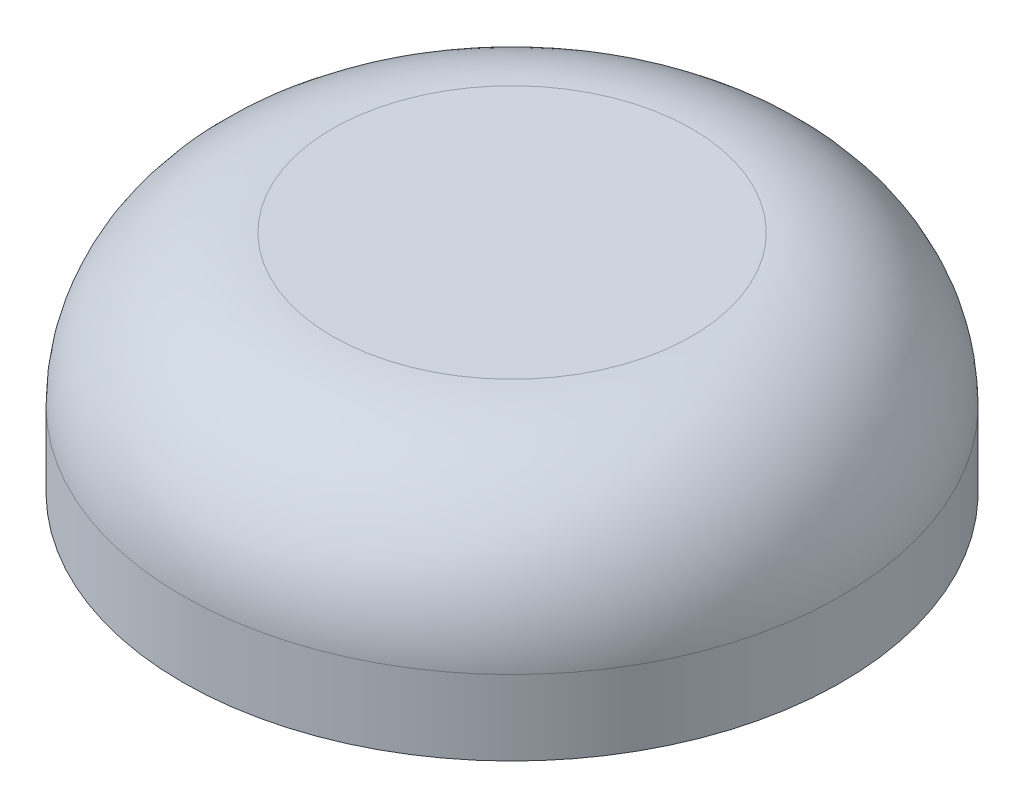
ISO-10303-21;
HEADER;
FILE_DESCRIPTION(('STEP AP214'),'2;1');
FILE_NAME('part.step','',(''),(''),'','','');
FILE_SCHEMA(('AUTOMOTIVE_DESIGN { 1 0 10303 214 1 1 1 1 }'));
ENDSEC;
DATA;
#1=APPLICATION_CONTEXT('core data for automotive mechanical design processes');
#2=APPLICATION_PROTOCOL_DEFINITION('international standard','automotive_design',2000,#1);
#3=PRODUCT_CONTEXT('',#1,'mechanical');
#4=PRODUCT('Part','Part','',(#3));
#5=PRODUCT_RELATED_PRODUCT_CATEGORY('part','',(#4));
#6=PRODUCT_DEFINITION_FORMATION('','',#4);
#7=PRODUCT_DEFINITION_CONTEXT('part definition',#1,'design');
#8=PRODUCT_DEFINITION('design','',#6,#7);
#9=PRODUCT_DEFINITION_SHAPE('','',#8);
#10=(LENGTH_UNIT() NAMED_UNIT(*) SI_UNIT(.MILLI.,.METRE.));
#11=(NAMED_UNIT(*) PLANE_ANGLE_UNIT() SI_UNIT($,.RADIAN.));
#12=(NAMED_UNIT(*) SI_UNIT($,.STERADIAN.) SOLID_ANGLE_UNIT());
#13=UNCERTAINTY_MEASURE_WITH_UNIT(LENGTH_MEASURE(1.E-05),#10,'distance_accuracy_value','');
#14=(GEOMETRIC_REPRESENTATION_CONTEXT(3) GLOBAL_UNCERTAINTY_ASSIGNED_CONTEXT((#13)) GLOBAL_UNIT_ASSIGNED_CONTEXT((#10,
#11,#12)) REPRESENTATION_CONTEXT('',''));
#15=CARTESIAN_POINT('',(0.,0.,0.));
#16=DIRECTION('',(0.,0.,1.));
#17=DIRECTION('',(1.,0.,0.));
#18=AXIS2_PLACEMENT_3D('',#15,#16,#17);
#19=CARTESIAN_POINT('',(0.,3.,0.));
#20=DIRECTION('',(0.,-1.,0.));
#21=DIRECTION('',(0.,0.,-1.));
#22=AXIS2_PLACEMENT_3D('',#19,#20,#21);
#23=CYLINDRICAL_SURFACE('',#22,4.4);
#24=CARTESIAN_POINT('',(0.,1.,0.));
#25=DIRECTION('',(0.,1.,0.));
#26=DIRECTION('',(0.,0.,1.));
#27=AXIS2_PLACEMENT_3D('',#24,#25,#26);
#28=CIRCLE('',#27,4.4);
#29=CARTESIAN_POINT('',(0.,1.,4.4));
#30=VERTEX_POINT('',#29);
#31=EDGE_CURVE('E10',#30,#30,#28,.F.);
#32=ORIENTED_EDGE('',*,*,#31,.T.);
#33=EDGE_LOOP('',(#32));
#34=FACE_BOUND('',#33,.T.);
#35=CARTESIAN_POINT('',(0.,0.,0.));
#36=DIRECTION('',(0.,1.,0.));
#37=DIRECTION('',(0.,0.,1.));
#38=AXIS2_PLACEMENT_3D('',#35,#36,#37);
#39=CIRCLE('',#38,4.4);
#40=CARTESIAN_POINT('',(0.,0.,4.4));
#41=VERTEX_POINT('',#40);
#42=EDGE_CURVE('E44',#41,#41,#39,.T.);
#43=ORIENTED_EDGE('',*,*,#42,.T.);
#44=EDGE_LOOP('',(#43));
#45=FACE_BOUND('',#44,.T.);
#46=ADVANCED_FACE('F33',(#34,#45),#23,.T.);
#47=CARTESIAN_POINT('',(0.,3.,0.));
#48=DIRECTION('',(0.,1.,0.));
#49=DIRECTION('',(0.,0.,1.));
#50=AXIS2_PLACEMENT_3D('',#47,#48,#49);
#51=PLANE('',#50);
#52=CARTESIAN_POINT('',(0.,3.,0.));
#53=DIRECTION('',(0.,1.,0.));
#54=DIRECTION('',(0.,0.,1.));
#55=AXIS2_PLACEMENT_3D('',#52,#53,#54);
#56=CIRCLE('',#55,2.4);
#57=CARTESIAN_POINT('',(0.,3.,2.4));
#58=VERTEX_POINT('',#57);
#59=EDGE_CURVE('E40',#58,#58,#56,.T.);
#60=ORIENTED_EDGE('',*,*,#59,.T.);
#61=EDGE_LOOP('',(#60));
#62=FACE_BOUND('',#61,.T.);
#63=ADVANCED_FACE('F54',(#62),#51,.T.);
#64=CARTESIAN_POINT('',(0.,0.,0.));
#65=DIRECTION('',(0.,1.,0.));
#66=DIRECTION('',(0.,0.,1.));
#67=AXIS2_PLACEMENT_3D('',#64,#65,#66);
#68=PLANE('',#67);
#69=ORIENTED_EDGE('',*,*,#42,.F.);
#70=EDGE_LOOP('',(#69));
#71=FACE_BOUND('',#70,.T.);
#72=ADVANCED_FACE('F52',(#71),#68,.F.);
#73=CARTESIAN_POINT('',(0.,1.,0.));
#74=DIRECTION('',(0.,1.,0.));
#75=DIRECTION('',(0.,0.,1.));
#76=AXIS2_PLACEMENT_3D('',#73,#74,#75);
#77=TOROIDAL_SURFACE('',#76,2.4,2.);
#78=ORIENTED_EDGE('',*,*,#31,.F.);
#79=EDGE_LOOP('',(#78));
#80=FACE_BOUND('',#79,.T.);
#81=ORIENTED_EDGE('',*,*,#59,.F.);
#82=EDGE_LOOP('',(#81));
#83=FACE_BOUND('',#82,.T.);
#84=ADVANCED_FACE('F35',(#80,#83),#77,.T.);
#85=CLOSED_SHELL('',(#46,#63,#72,#84));
#86=MANIFOLD_SOLID_BREP('B2',#85);
#87=ADVANCED_BREP_SHAPE_REPRESENTATION('',(#18,#86),#14);
#88=SHAPE_DEFINITION_REPRESENTATION(#9,#87);
ENDSEC;
END-ISO-10303-21;
